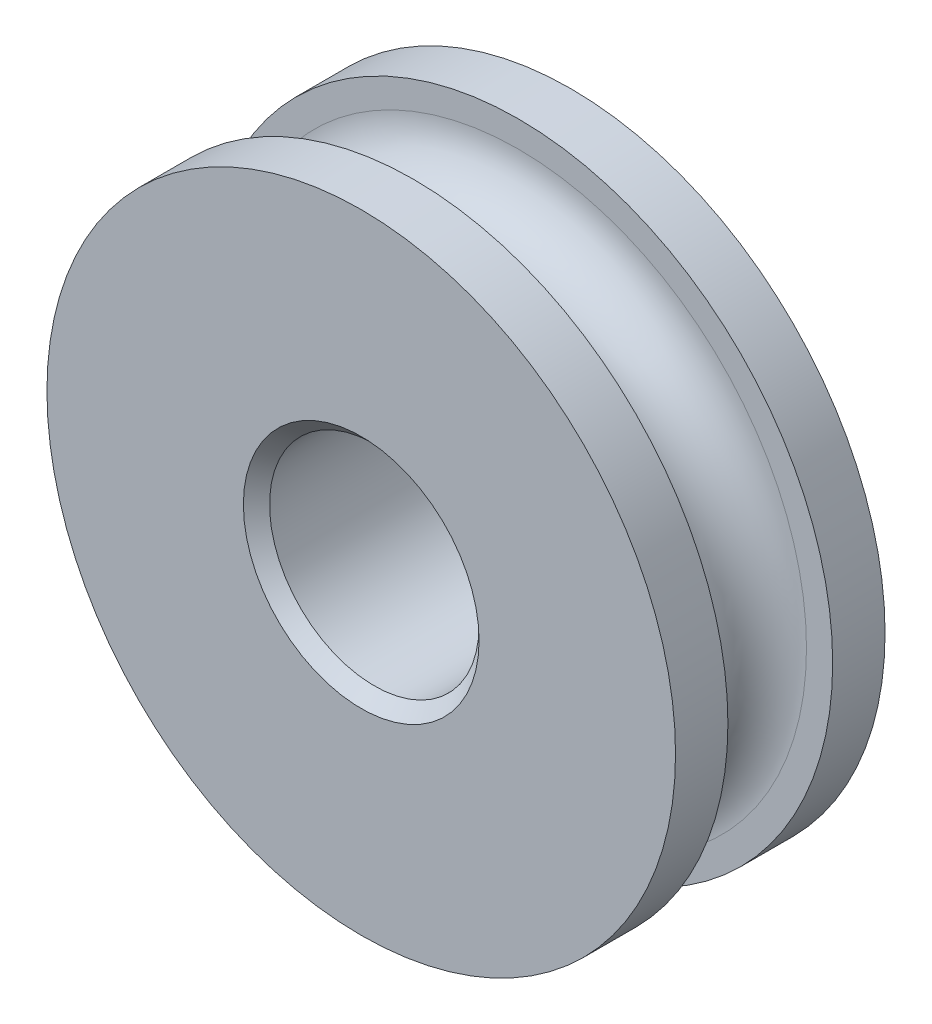
ISO-10303-21;
HEADER;
FILE_DESCRIPTION(('STEP AP214'),'2;1');
FILE_NAME('part.step','',(''),(''),'','','');
FILE_SCHEMA(('AUTOMOTIVE_DESIGN { 1 0 10303 214 1 1 1 1 }'));
ENDSEC;
DATA;
#1=APPLICATION_CONTEXT('core data for automotive mechanical design processes');
#2=APPLICATION_PROTOCOL_DEFINITION('international standard','automotive_design',2000,#1);
#3=PRODUCT_CONTEXT('',#1,'mechanical');
#4=PRODUCT('Part','Part','',(#3));
#5=PRODUCT_RELATED_PRODUCT_CATEGORY('part','',(#4));
#6=PRODUCT_DEFINITION_FORMATION('','',#4);
#7=PRODUCT_DEFINITION_CONTEXT('part definition',#1,'design');
#8=PRODUCT_DEFINITION('design','',#6,#7);
#9=PRODUCT_DEFINITION_SHAPE('','',#8);
#10=(LENGTH_UNIT() NAMED_UNIT(*) SI_UNIT(.MILLI.,.METRE.));
#11=(NAMED_UNIT(*) PLANE_ANGLE_UNIT() SI_UNIT($,.RADIAN.));
#12=(NAMED_UNIT(*) SI_UNIT($,.STERADIAN.) SOLID_ANGLE_UNIT());
#13=UNCERTAINTY_MEASURE_WITH_UNIT(LENGTH_MEASURE(1.E-05),#10,'distance_accuracy_value','');
#14=(GEOMETRIC_REPRESENTATION_CONTEXT(3) GLOBAL_UNCERTAINTY_ASSIGNED_CONTEXT((#13)) GLOBAL_UNIT_ASSIGNED_CONTEXT((#10,
#11,#12)) REPRESENTATION_CONTEXT('',''));
#15=CARTESIAN_POINT('',(0.,0.,0.));
#16=DIRECTION('',(0.,0.,1.));
#17=DIRECTION('',(1.,0.,0.));
#18=AXIS2_PLACEMENT_3D('',#15,#16,#17);
#19=CARTESIAN_POINT('',(0.,0.,6.35));
#20=DIRECTION('',(0.,0.,-1.));
#21=DIRECTION('',(-1.,0.,0.));
#22=AXIS2_PLACEMENT_3D('',#19,#20,#21);
#23=CYLINDRICAL_SURFACE('',#22,19.05);
#24=CARTESIAN_POINT('',(0.,0.,-6.35));
#25=DIRECTION('',(0.,0.,1.));
#26=DIRECTION('',(1.,0.,0.));
#27=AXIS2_PLACEMENT_3D('',#24,#25,#26);
#28=CIRCLE('',#27,19.05);
#29=CARTESIAN_POINT('',(19.05,0.,-6.35));
#30=VERTEX_POINT('',#29);
#31=EDGE_CURVE('E51',#30,#30,#28,.T.);
#32=ORIENTED_EDGE('',*,*,#31,.T.);
#33=EDGE_LOOP('',(#32));
#34=FACE_BOUND('',#33,.T.);
#35=CARTESIAN_POINT('',(0.,0.,-3.17499999999998));
#36=DIRECTION('',(0.,0.,1.));
#37=DIRECTION('',(0.,-1.,0.));
#38=AXIS2_PLACEMENT_3D('',#35,#36,#37);
#39=CIRCLE('',#38,19.05);
#40=CARTESIAN_POINT('',(0.,-19.05,-3.17499999999996));
#41=VERTEX_POINT('',#40);
#42=EDGE_CURVE('E59',#41,#41,#39,.T.);
#43=ORIENTED_EDGE('',*,*,#42,.F.);
#44=EDGE_LOOP('',(#43));
#45=FACE_BOUND('',#44,.T.);
#46=ADVANCED_FACE('F30',(#34,#45),#23,.T.);
#47=CARTESIAN_POINT('',(0.,0.,6.35));
#48=DIRECTION('',(0.,0.,1.));
#49=DIRECTION('',(1.,0.,0.));
#50=AXIS2_PLACEMENT_3D('',#47,#48,#49);
#51=CIRCLE('',#50,19.05);
#52=CARTESIAN_POINT('',(19.05,0.,6.35));
#53=VERTEX_POINT('',#52);
#54=EDGE_CURVE('E50',#53,#53,#51,.T.);
#55=ORIENTED_EDGE('',*,*,#54,.F.);
#56=EDGE_LOOP('',(#55));
#57=FACE_BOUND('',#56,.T.);
#58=CARTESIAN_POINT('',(0.,0.,3.17500000000002));
#59=DIRECTION('',(0.,0.,1.));
#60=DIRECTION('',(0.,-1.,0.));
#61=AXIS2_PLACEMENT_3D('',#58,#59,#60);
#62=CIRCLE('',#61,19.05);
#63=CARTESIAN_POINT('',(0.,-19.05,3.17500000000004));
#64=VERTEX_POINT('',#63);
#65=EDGE_CURVE('E62',#64,#64,#62,.T.);
#66=ORIENTED_EDGE('',*,*,#65,.T.);
#67=EDGE_LOOP('',(#66));
#68=FACE_BOUND('',#67,.T.);
#69=ADVANCED_FACE('F87',(#57,#68),#23,.T.);
#70=CARTESIAN_POINT('',(0.,0.,6.35));
#71=DIRECTION('',(0.,0.,1.));
#72=DIRECTION('',(1.,0.,0.));
#73=AXIS2_PLACEMENT_3D('',#70,#71,#72);
#74=PLANE('',#73);
#75=CARTESIAN_POINT('',(0.,0.,6.35));
#76=DIRECTION('',(0.,0.,1.));
#77=DIRECTION('',(1.,0.,0.));
#78=AXIS2_PLACEMENT_3D('',#75,#76,#77);
#79=CIRCLE('',#78,7.14375);
#80=CARTESIAN_POINT('',(7.14375,0.,6.35));
#81=VERTEX_POINT('',#80);
#82=EDGE_CURVE('E10',#81,#81,#79,.F.);
#83=ORIENTED_EDGE('',*,*,#82,.T.);
#84=EDGE_LOOP('',(#83));
#85=FACE_BOUND('',#84,.T.);
#86=ORIENTED_EDGE('',*,*,#54,.T.);
#87=EDGE_LOOP('',(#86));
#88=FACE_BOUND('',#87,.T.);
#89=ADVANCED_FACE('F93',(#85,#88),#74,.T.);
#90=CARTESIAN_POINT('',(0.,0.,-6.35));
#91=DIRECTION('',(0.,0.,1.));
#92=DIRECTION('',(1.,0.,0.));
#93=AXIS2_PLACEMENT_3D('',#90,#91,#92);
#94=PLANE('',#93);
#95=CARTESIAN_POINT('',(0.,0.,-6.35));
#96=DIRECTION('',(0.,0.,1.));
#97=DIRECTION('',(1.,0.,0.));
#98=AXIS2_PLACEMENT_3D('',#95,#96,#97);
#99=CIRCLE('',#98,7.14375);
#100=CARTESIAN_POINT('',(7.14375,0.,-6.35));
#101=VERTEX_POINT('',#100);
#102=EDGE_CURVE('E45',#101,#101,#99,.T.);
#103=ORIENTED_EDGE('',*,*,#102,.T.);
#104=EDGE_LOOP('',(#103));
#105=FACE_BOUND('',#104,.T.);
#106=ORIENTED_EDGE('',*,*,#31,.F.);
#107=EDGE_LOOP('',(#106));
#108=FACE_BOUND('',#107,.T.);
#109=ADVANCED_FACE('F97',(#105,#108),#94,.F.);
#110=CARTESIAN_POINT('',(0.,0.,6.35));
#111=DIRECTION('',(0.,0.,-1.));
#112=DIRECTION('',(-1.,0.,0.));
#113=AXIS2_PLACEMENT_3D('',#110,#111,#112);
#114=CYLINDRICAL_SURFACE('',#113,6.35);
#115=CARTESIAN_POINT('',(0.,0.,-5.55624999999999));
#116=DIRECTION('',(0.,0.,1.));
#117=DIRECTION('',(1.,0.,0.));
#118=AXIS2_PLACEMENT_3D('',#115,#116,#117);
#119=CIRCLE('',#118,6.35);
#120=CARTESIAN_POINT('',(6.35,0.,-5.55624999999999));
#121=VERTEX_POINT('',#120);
#122=EDGE_CURVE('E37',#121,#121,#119,.F.);
#123=ORIENTED_EDGE('',*,*,#122,.T.);
#124=EDGE_LOOP('',(#123));
#125=FACE_BOUND('',#124,.T.);
#126=CARTESIAN_POINT('',(0.,0.,5.55625));
#127=DIRECTION('',(0.,0.,1.));
#128=DIRECTION('',(1.,0.,0.));
#129=AXIS2_PLACEMENT_3D('',#126,#127,#128);
#130=CIRCLE('',#129,6.35);
#131=CARTESIAN_POINT('',(6.35,0.,5.55625));
#132=VERTEX_POINT('',#131);
#133=EDGE_CURVE('E41',#132,#132,#130,.T.);
#134=ORIENTED_EDGE('',*,*,#133,.T.);
#135=EDGE_LOOP('',(#134));
#136=FACE_BOUND('',#135,.T.);
#137=ADVANCED_FACE('F100',(#125,#136),#114,.F.);
#138=CARTESIAN_POINT('',(0.,0.,-6.35));
#139=DIRECTION('',(0.,0.,-1.));
#140=DIRECTION('',(-1.,0.,0.));
#141=AXIS2_PLACEMENT_3D('',#138,#139,#140);
#142=CONICAL_SURFACE('',#141,7.14375,0.785398163397447);
#143=ORIENTED_EDGE('',*,*,#122,.F.);
#144=EDGE_LOOP('',(#143));
#145=FACE_BOUND('',#144,.T.);
#146=ORIENTED_EDGE('',*,*,#102,.F.);
#147=EDGE_LOOP('',(#146));
#148=FACE_BOUND('',#147,.T.);
#149=ADVANCED_FACE('F83',(#145,#148),#142,.F.);
#150=CARTESIAN_POINT('',(0.,0.,5.55625));
#151=DIRECTION('',(0.,0.,1.));
#152=DIRECTION('',(1.,0.,0.));
#153=AXIS2_PLACEMENT_3D('',#150,#151,#152);
#154=CONICAL_SURFACE('',#153,6.35,0.785398163397449);
#155=CARTESIAN_POINT('',(7.14375,0.,6.35));
#156=CARTESIAN_POINT('',(7.13548177083334,0.,6.34173177083333));
#157=CARTESIAN_POINT('',(7.12721354166667,0.,6.33346354166667));
#158=CARTESIAN_POINT('',(7.11067708333334,0.,6.31692708333333));
#159=CARTESIAN_POINT('',(7.10240885416667,0.,6.30865885416667));
#160=CARTESIAN_POINT('',(7.08587239583334,0.,6.29212239583333));
#161=CARTESIAN_POINT('',(7.07760416666667,0.,6.28385416666667));
#162=CARTESIAN_POINT('',(7.06106770833334,0.,6.26731770833333));
#163=CARTESIAN_POINT('',(7.05279947916667,0.,6.25904947916667));
#164=CARTESIAN_POINT('',(7.03626302083334,0.,6.24251302083333));
#165=CARTESIAN_POINT('',(7.02799479166667,0.,6.23424479166667));
#166=CARTESIAN_POINT('',(7.01145833333334,0.,6.21770833333333));
#167=CARTESIAN_POINT('',(7.00319010416667,0.,6.20944010416667));
#168=CARTESIAN_POINT('',(6.98665364583334,0.,6.19290364583333));
#169=CARTESIAN_POINT('',(6.97838541666667,0.,6.18463541666667));
#170=CARTESIAN_POINT('',(6.96184895833334,0.,6.16809895833333));
#171=CARTESIAN_POINT('',(6.95358072916667,0.,6.15983072916667));
#172=CARTESIAN_POINT('',(6.93704427083334,0.,6.14329427083333));
#173=CARTESIAN_POINT('',(6.92877604166667,0.,6.13502604166666));
#174=CARTESIAN_POINT('',(6.91223958333333,0.,6.11848958333333));
#175=CARTESIAN_POINT('',(6.90397135416667,0.,6.11022135416667));
#176=CARTESIAN_POINT('',(6.88743489583334,0.,6.09368489583333));
#177=CARTESIAN_POINT('',(6.87916666666667,0.,6.08541666666667));
#178=CARTESIAN_POINT('',(6.86263020833334,0.,6.06888020833333));
#179=CARTESIAN_POINT('',(6.85436197916667,0.,6.06061197916666));
#180=CARTESIAN_POINT('',(6.83782552083334,0.,6.04407552083333));
#181=CARTESIAN_POINT('',(6.82955729166667,0.,6.03580729166666));
#182=CARTESIAN_POINT('',(6.81302083333333,0.,6.01927083333333));
#183=CARTESIAN_POINT('',(6.80475260416667,0.,6.01100260416667));
#184=CARTESIAN_POINT('',(6.78821614583333,0.,5.99446614583333));
#185=CARTESIAN_POINT('',(6.77994791666667,0.,5.98619791666667));
#186=CARTESIAN_POINT('',(6.76341145833333,0.,5.96966145833333));
#187=CARTESIAN_POINT('',(6.75514322916667,0.,5.96139322916666));
#188=CARTESIAN_POINT('',(6.73860677083333,0.,5.94485677083333));
#189=CARTESIAN_POINT('',(6.73033854166667,0.,5.93658854166666));
#190=CARTESIAN_POINT('',(6.71380208333333,0.,5.92005208333333));
#191=CARTESIAN_POINT('',(6.70553385416667,0.,5.91178385416667));
#192=CARTESIAN_POINT('',(6.68899739583333,0.,5.89524739583333));
#193=CARTESIAN_POINT('',(6.68072916666667,0.,5.88697916666666));
#194=CARTESIAN_POINT('',(6.66419270833333,0.,5.87044270833333));
#195=CARTESIAN_POINT('',(6.65592447916667,0.,5.86217447916666));
#196=CARTESIAN_POINT('',(6.63938802083333,0.,5.84563802083333));
#197=CARTESIAN_POINT('',(6.63111979166667,0.,5.83736979166666));
#198=CARTESIAN_POINT('',(6.61458333333333,0.,5.82083333333333));
#199=CARTESIAN_POINT('',(6.60631510416667,0.,5.81256510416666));
#200=CARTESIAN_POINT('',(6.58977864583333,0.,5.79602864583333));
#201=CARTESIAN_POINT('',(6.58151041666667,0.,5.78776041666666));
#202=CARTESIAN_POINT('',(6.56497395833333,0.,5.77122395833333));
#203=CARTESIAN_POINT('',(6.55670572916667,0.,5.76295572916666));
#204=CARTESIAN_POINT('',(6.54016927083333,0.,5.74641927083333));
#205=CARTESIAN_POINT('',(6.53190104166667,0.,5.73815104166666));
#206=CARTESIAN_POINT('',(6.51536458333333,0.,5.72161458333333));
#207=CARTESIAN_POINT('',(6.50709635416667,0.,5.71334635416666));
#208=CARTESIAN_POINT('',(6.49055989583333,0.,5.69680989583333));
#209=CARTESIAN_POINT('',(6.48229166666667,0.,5.68854166666666));
#210=CARTESIAN_POINT('',(6.46575520833333,0.,5.67200520833333));
#211=CARTESIAN_POINT('',(6.45748697916667,0.,5.66373697916666));
#212=CARTESIAN_POINT('',(6.44095052083333,0.,5.64720052083333));
#213=CARTESIAN_POINT('',(6.43268229166667,0.,5.63893229166666));
#214=CARTESIAN_POINT('',(6.41614583333333,0.,5.62239583333333));
#215=CARTESIAN_POINT('',(6.40787760416667,0.,5.61412760416666));
#216=CARTESIAN_POINT('',(6.39134114583333,0.,5.59759114583333));
#217=CARTESIAN_POINT('',(6.38307291666667,0.,5.58932291666666));
#218=CARTESIAN_POINT('',(6.36653645833333,0.,5.57278645833333));
#219=CARTESIAN_POINT('',(6.35826822916667,0.,5.56451822916666));
#220=CARTESIAN_POINT('',(6.35,0.,5.55625));
#221=B_SPLINE_CURVE_WITH_KNOTS('',3,(#155,#156,#157,#158,#159,#160,#161,#162,#163,#164,#165,
#166,#167,#168,#169,#170,#171,#172,#173,#174,#175,#176,#177,#178,#179,#180,#181,#182,#183,#184,
#185,#186,#187,#188,#189,#190,#191,#192,#193,#194,#195,#196,#197,#198,#199,#200,#201,#202,#203,
#204,#205,#206,#207,#208,#209,#210,#211,#212,#213,#214,#215,#216,#217,#218,#219,#220),
.UNSPECIFIED.,.F.,.F.,(4,2,2,2,2,2,2,2,2,2,2,2,2,2,2,2,2,2,2,2,2,2,2,2,2,2,2,2,2,2,2,2,4),(0.,
0.0350791254729262,0.070158250945853,0.10523737641878,0.140316501891707,0.175395627364632,
0.210474752837559,0.245553878310486,0.280633003783413,0.315712129256339,0.350791254729266,
0.385870380202192,0.420949505675119,0.456028631148045,0.491107756620972,0.526186882093898,
0.561266007566825,0.596345133039751,0.631424258512677,0.666503383985604,0.701582509458531,
0.736661634931457,0.771740760404384,0.80681988587731,0.841899011350237,0.876978136823163,
0.91205726229609,0.947136387769016,0.982215513241943,1.01729463871487,1.0523737641878,
1.08745288966072,1.12253201513365),.UNSPECIFIED.);
#222=EDGE_CURVE('BSEAM32',#81,#132,#221,.T.);
#223=ORIENTED_EDGE('',*,*,#82,.F.);
#224=ORIENTED_EDGE('',*,*,#133,.F.);
#225=ORIENTED_EDGE('',*,*,#222,.T.);
#226=ORIENTED_EDGE('',*,*,#222,.F.);
#227=EDGE_LOOP('',(#223,#225,#224,#226));
#228=FACE_BOUND('',#227,.T.);
#229=ADVANCED_FACE('F32',(#228),#154,.F.);
#230=CARTESIAN_POINT('',(0.,0.,0.));
#231=DIRECTION('',(0.,0.,1.));
#232=DIRECTION('',(0.,-1.,0.));
#233=AXIS2_PLACEMENT_3D('',#230,#231,#232);
#234=TOROIDAL_SURFACE('',#233,17.4625,3.175);
#235=CARTESIAN_POINT('',(0.,0.,-3.17499999999998));
#236=DIRECTION('',(0.,0.,1.));
#237=DIRECTION('',(0.,-1.,0.));
#238=AXIS2_PLACEMENT_3D('',#235,#236,#237);
#239=CIRCLE('',#238,17.4625);
#240=CARTESIAN_POINT('',(0.,-17.4625,-3.17499999999996));
#241=VERTEX_POINT('',#240);
#242=EDGE_CURVE('E54',#241,#241,#239,.T.);
#243=ORIENTED_EDGE('',*,*,#242,.T.);
#244=EDGE_LOOP('',(#243));
#245=FACE_BOUND('',#244,.T.);
#246=CARTESIAN_POINT('',(0.,0.,3.17500000000002));
#247=DIRECTION('',(0.,0.,1.));
#248=DIRECTION('',(0.,-1.,0.));
#249=AXIS2_PLACEMENT_3D('',#246,#247,#248);
#250=CIRCLE('',#249,17.4625);
#251=CARTESIAN_POINT('',(0.,-17.4625,3.17500000000004));
#252=VERTEX_POINT('',#251);
#253=EDGE_CURVE('E65',#252,#252,#250,.T.);
#254=ORIENTED_EDGE('',*,*,#253,.F.);
#255=EDGE_LOOP('',(#254));
#256=FACE_BOUND('',#255,.T.);
#257=ADVANCED_FACE('F72',(#245,#256),#234,.F.);
#258=CARTESIAN_POINT('',(0.,17.4625,-3.175));
#259=DIRECTION('',(0.,0.,1.));
#260=DIRECTION('',(0.,-1.,0.));
#261=AXIS2_PLACEMENT_3D('',#258,#259,#260);
#262=PLANE('',#261);
#263=ORIENTED_EDGE('',*,*,#42,.T.);
#264=EDGE_LOOP('',(#263));
#265=FACE_BOUND('',#264,.T.);
#266=ORIENTED_EDGE('',*,*,#242,.F.);
#267=EDGE_LOOP('',(#266));
#268=FACE_BOUND('',#267,.T.);
#269=ADVANCED_FACE('F74',(#265,#268),#262,.T.);
#270=CARTESIAN_POINT('',(0.,17.4625,3.175));
#271=DIRECTION('',(0.,0.,-1.));
#272=DIRECTION('',(0.,1.,0.));
#273=AXIS2_PLACEMENT_3D('',#270,#271,#272);
#274=PLANE('',#273);
#275=ORIENTED_EDGE('',*,*,#253,.T.);
#276=EDGE_LOOP('',(#275));
#277=FACE_BOUND('',#276,.T.);
#278=ORIENTED_EDGE('',*,*,#65,.F.);
#279=EDGE_LOOP('',(#278));
#280=FACE_BOUND('',#279,.T.);
#281=ADVANCED_FACE('F69',(#277,#280),#274,.T.);
#282=CLOSED_SHELL('',(#46,#69,#89,#109,#137,#149,#229,#257,#269,#281));
#283=MANIFOLD_SOLID_BREP('B2',#282);
#284=ADVANCED_BREP_SHAPE_REPRESENTATION('',(#18,#283),#14);
#285=SHAPE_DEFINITION_REPRESENTATION(#9,#284);
ENDSEC;
END-ISO-10303-21;
